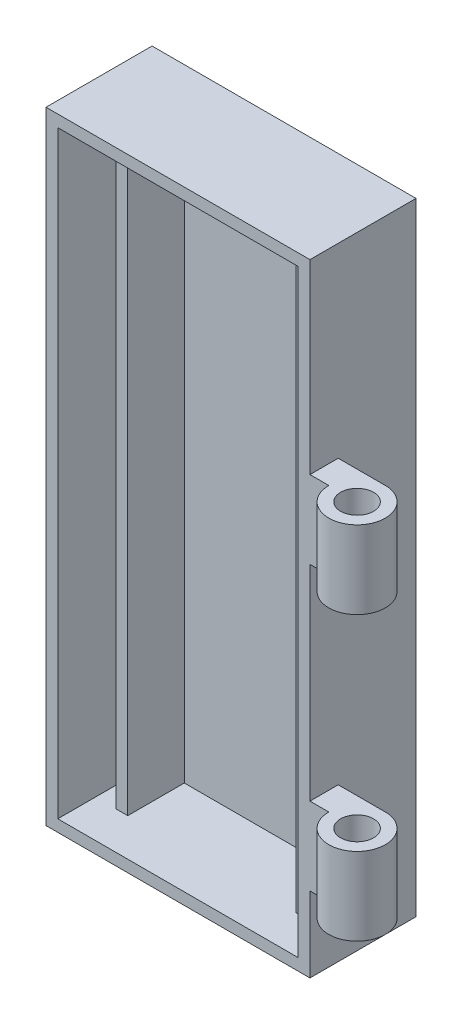
ISO-10303-21;
HEADER;
FILE_DESCRIPTION(('STEP AP214'),'2;1');
FILE_NAME('part.step','',(''),(''),'','','');
FILE_SCHEMA(('AUTOMOTIVE_DESIGN { 1 0 10303 214 1 1 1 1 }'));
ENDSEC;
DATA;
#1=APPLICATION_CONTEXT('core data for automotive mechanical design processes');
#2=APPLICATION_PROTOCOL_DEFINITION('international standard','automotive_design',2000,#1);
#3=PRODUCT_CONTEXT('',#1,'mechanical');
#4=PRODUCT('Part','Part','',(#3));
#5=PRODUCT_RELATED_PRODUCT_CATEGORY('part','',(#4));
#6=PRODUCT_DEFINITION_FORMATION('','',#4);
#7=PRODUCT_DEFINITION_CONTEXT('part definition',#1,'design');
#8=PRODUCT_DEFINITION('design','',#6,#7);
#9=PRODUCT_DEFINITION_SHAPE('','',#8);
#10=(LENGTH_UNIT() NAMED_UNIT(*) SI_UNIT(.MILLI.,.METRE.));
#11=(NAMED_UNIT(*) PLANE_ANGLE_UNIT() SI_UNIT($,.RADIAN.));
#12=(NAMED_UNIT(*) SI_UNIT($,.STERADIAN.) SOLID_ANGLE_UNIT());
#13=UNCERTAINTY_MEASURE_WITH_UNIT(LENGTH_MEASURE(1.E-05),#10,'distance_accuracy_value','');
#14=(GEOMETRIC_REPRESENTATION_CONTEXT(3) GLOBAL_UNCERTAINTY_ASSIGNED_CONTEXT((#13)) GLOBAL_UNIT_ASSIGNED_CONTEXT((#10,
#11,#12)) REPRESENTATION_CONTEXT('',''));
#15=CARTESIAN_POINT('',(0.,0.,0.));
#16=DIRECTION('',(0.,0.,1.));
#17=DIRECTION('',(1.,0.,0.));
#18=AXIS2_PLACEMENT_3D('',#15,#16,#17);
#19=CARTESIAN_POINT('',(0.,0.,11.25));
#20=DIRECTION('',(0.,0.,1.));
#21=DIRECTION('',(1.,0.,0.));
#22=AXIS2_PLACEMENT_3D('',#19,#20,#21);
#23=PLANE('',#22);
#24=DIRECTION('',(1.,0.,0.));
#25=VECTOR('',#24,1.);
#26=CARTESIAN_POINT('',(-12.75,-31.75,11.25));
#27=LINE('',#26,#25);
#28=CARTESIAN_POINT('',(-12.75,-31.75,11.25));
#29=VERTEX_POINT('',#28);
#30=CARTESIAN_POINT('',(12.75,-31.75,11.25));
#31=VERTEX_POINT('',#30);
#32=EDGE_CURVE('E342',#29,#31,#27,.T.);
#33=ORIENTED_EDGE('',*,*,#32,.F.);
#34=DIRECTION('',(0.,-1.,0.));
#35=VECTOR('',#34,1.);
#36=CARTESIAN_POINT('',(-12.75,31.75,11.25));
#37=LINE('',#36,#35);
#38=CARTESIAN_POINT('',(-12.75,31.75,11.25));
#39=VERTEX_POINT('',#38);
#40=EDGE_CURVE('E339',#39,#29,#37,.T.);
#41=ORIENTED_EDGE('',*,*,#40,.F.);
#42=DIRECTION('',(-1.,0.,0.));
#43=VECTOR('',#42,1.);
#44=CARTESIAN_POINT('',(-12.75,31.75,11.25));
#45=LINE('',#44,#43);
#46=CARTESIAN_POINT('',(12.75,31.75,11.25));
#47=VERTEX_POINT('',#46);
#48=EDGE_CURVE('E350',#47,#39,#45,.T.);
#49=ORIENTED_EDGE('',*,*,#48,.F.);
#50=DIRECTION('',(0.,1.,0.));
#51=VECTOR('',#50,1.);
#52=CARTESIAN_POINT('',(12.75,31.75,11.25));
#53=LINE('',#52,#51);
#54=EDGE_CURVE('E346',#31,#47,#53,.T.);
#55=ORIENTED_EDGE('',*,*,#54,.F.);
#56=EDGE_LOOP('',(#33,#41,#49,#55));
#57=FACE_BOUND('',#56,.T.);
#58=DIRECTION('',(0.,1.,0.));
#59=VECTOR('',#58,1.);
#60=CARTESIAN_POINT('',(14.,0.,11.25));
#61=LINE('',#60,#59);
#62=CARTESIAN_POINT('',(14.,-33.,11.25));
#63=VERTEX_POINT('',#62);
#64=CARTESIAN_POINT('',(14.,-25.,11.25));
#65=VERTEX_POINT('',#64);
#66=EDGE_CURVE('E234',#63,#65,#61,.T.);
#67=ORIENTED_EDGE('',*,*,#66,.T.);
#68=DIRECTION('',(1.,0.,0.));
#69=VECTOR('',#68,1.);
#70=CARTESIAN_POINT('',(0.,-25.,11.25));
#71=LINE('',#70,#69);
#72=CARTESIAN_POINT('',(16.,-25.,11.25));
#73=VERTEX_POINT('',#72);
#74=EDGE_CURVE('E248',#65,#73,#71,.T.);
#75=ORIENTED_EDGE('',*,*,#74,.T.);
#76=DIRECTION('',(0.,-1.,0.));
#77=VECTOR('',#76,1.);
#78=CARTESIAN_POINT('',(16.,13.25,11.25));
#79=LINE('',#78,#77);
#80=CARTESIAN_POINT('',(16.,-16.75,11.25));
#81=VERTEX_POINT('',#80);
#82=EDGE_CURVE('E232',#81,#73,#79,.T.);
#83=ORIENTED_EDGE('',*,*,#82,.F.);
#84=DIRECTION('',(-1.,0.,0.));
#85=VECTOR('',#84,1.);
#86=CARTESIAN_POINT('',(0.,-16.75,11.25));
#87=LINE('',#86,#85);
#88=CARTESIAN_POINT('',(14.,-16.75,11.25));
#89=VERTEX_POINT('',#88);
#90=EDGE_CURVE('E222',#81,#89,#87,.T.);
#91=ORIENTED_EDGE('',*,*,#90,.T.);
#92=DIRECTION('',(0.,1.,0.));
#93=VECTOR('',#92,1.);
#94=CARTESIAN_POINT('',(14.,0.,11.25));
#95=LINE('',#94,#93);
#96=CARTESIAN_POINT('',(14.,5.,11.25));
#97=VERTEX_POINT('',#96);
#98=EDGE_CURVE('E209',#89,#97,#95,.T.);
#99=ORIENTED_EDGE('',*,*,#98,.T.);
#100=DIRECTION('',(1.,0.,0.));
#101=VECTOR('',#100,1.);
#102=CARTESIAN_POINT('',(0.,5.,11.25));
#103=LINE('',#102,#101);
#104=CARTESIAN_POINT('',(16.,5.,11.25));
#105=VERTEX_POINT('',#104);
#106=EDGE_CURVE('E241',#97,#105,#103,.T.);
#107=ORIENTED_EDGE('',*,*,#106,.T.);
#108=CARTESIAN_POINT('',(16.,13.25,11.25));
#109=VERTEX_POINT('',#108);
#110=EDGE_CURVE('E268',#109,#105,#79,.T.);
#111=ORIENTED_EDGE('',*,*,#110,.F.);
#112=DIRECTION('',(-1.,0.,0.));
#113=VECTOR('',#112,1.);
#114=CARTESIAN_POINT('',(16.,13.25,11.25));
#115=LINE('',#114,#113);
#116=CARTESIAN_POINT('',(14.,13.25,11.25));
#117=VERTEX_POINT('',#116);
#118=EDGE_CURVE('E263',#109,#117,#115,.T.);
#119=ORIENTED_EDGE('',*,*,#118,.T.);
#120=DIRECTION('',(0.,1.,0.));
#121=VECTOR('',#120,1.);
#122=CARTESIAN_POINT('',(14.,33.,11.25));
#123=LINE('',#122,#121);
#124=CARTESIAN_POINT('',(14.,33.,11.25));
#125=VERTEX_POINT('',#124);
#126=EDGE_CURVE('E390',#117,#125,#123,.T.);
#127=ORIENTED_EDGE('',*,*,#126,.T.);
#128=DIRECTION('',(-1.,0.,0.));
#129=VECTOR('',#128,1.);
#130=CARTESIAN_POINT('',(-14.,33.,11.25));
#131=LINE('',#130,#129);
#132=CARTESIAN_POINT('',(-14.,33.,11.25));
#133=VERTEX_POINT('',#132);
#134=EDGE_CURVE('E393',#125,#133,#131,.T.);
#135=ORIENTED_EDGE('',*,*,#134,.T.);
#136=DIRECTION('',(0.,-1.,0.));
#137=VECTOR('',#136,1.);
#138=CARTESIAN_POINT('',(-14.,33.,11.25));
#139=LINE('',#138,#137);
#140=CARTESIAN_POINT('',(-14.,-33.,11.25));
#141=VERTEX_POINT('',#140);
#142=EDGE_CURVE('E382',#133,#141,#139,.T.);
#143=ORIENTED_EDGE('',*,*,#142,.T.);
#144=DIRECTION('',(1.,0.,0.));
#145=VECTOR('',#144,1.);
#146=CARTESIAN_POINT('',(-14.,-33.,11.25));
#147=LINE('',#146,#145);
#148=EDGE_CURVE('E386',#141,#63,#147,.T.);
#149=ORIENTED_EDGE('',*,*,#148,.T.);
#150=EDGE_LOOP('',(#67,#75,#83,#91,#99,#107,#111,#119,#127,#135,#143,#149));
#151=FACE_BOUND('',#150,.T.);
#152=ADVANCED_FACE('F47',(#57,#151),#23,.T.);
#153=CARTESIAN_POINT('',(-14.,-33.,1.25));
#154=DIRECTION('',(0.,1.,0.));
#155=DIRECTION('',(0.,0.,1.));
#156=AXIS2_PLACEMENT_3D('',#153,#154,#155);
#157=PLANE('',#156);
#158=DIRECTION('',(0.,0.,-1.));
#159=VECTOR('',#158,1.);
#160=CARTESIAN_POINT('',(14.,-33.,1.25));
#161=LINE('',#160,#159);
#162=CARTESIAN_POINT('',(14.,-33.,0.));
#163=VERTEX_POINT('',#162);
#164=EDGE_CURVE('E439',#63,#163,#161,.T.);
#165=ORIENTED_EDGE('',*,*,#164,.F.);
#166=ORIENTED_EDGE('',*,*,#148,.F.);
#167=DIRECTION('',(0.,0.,-1.));
#168=VECTOR('',#167,1.);
#169=CARTESIAN_POINT('',(-14.,-33.,1.25));
#170=LINE('',#169,#168);
#171=CARTESIAN_POINT('',(-14.,-33.,0.));
#172=VERTEX_POINT('',#171);
#173=EDGE_CURVE('E442',#141,#172,#170,.T.);
#174=ORIENTED_EDGE('',*,*,#173,.T.);
#175=DIRECTION('',(1.,0.,0.));
#176=VECTOR('',#175,1.);
#177=CARTESIAN_POINT('',(-14.,-33.,0.));
#178=LINE('',#177,#176);
#179=EDGE_CURVE('E421',#172,#163,#178,.T.);
#180=ORIENTED_EDGE('',*,*,#179,.T.);
#181=EDGE_LOOP('',(#165,#166,#174,#180));
#182=FACE_BOUND('',#181,.T.);
#183=ADVANCED_FACE('F467',(#182),#157,.F.);
#184=CARTESIAN_POINT('',(19.,13.25,11.25));
#185=DIRECTION('',(0.,-1.,0.));
#186=DIRECTION('',(0.,0.,-1.));
#187=AXIS2_PLACEMENT_3D('',#184,#185,#186);
#188=CYLINDRICAL_SURFACE('',#187,3.);
#189=ORIENTED_EDGE('',*,*,#82,.T.);
#190=CARTESIAN_POINT('',(19.,-25.,11.25));
#191=DIRECTION('',(0.,-1.,0.));
#192=DIRECTION('',(0.,0.,-1.));
#193=AXIS2_PLACEMENT_3D('',#190,#191,#192);
#194=CIRCLE('',#193,3.);
#195=CARTESIAN_POINT('',(19.,-25.,8.25));
#196=VERTEX_POINT('',#195);
#197=EDGE_CURVE('E239',#73,#196,#194,.F.);
#198=ORIENTED_EDGE('',*,*,#197,.T.);
#199=DIRECTION('',(0.,-1.,0.));
#200=VECTOR('',#199,1.);
#201=CARTESIAN_POINT('',(19.,13.25,8.25));
#202=LINE('',#201,#200);
#203=CARTESIAN_POINT('',(19.,-16.75,8.25));
#204=VERTEX_POINT('',#203);
#205=EDGE_CURVE('E277',#204,#196,#202,.T.);
#206=ORIENTED_EDGE('',*,*,#205,.F.);
#207=CARTESIAN_POINT('',(19.,-16.75,11.25));
#208=DIRECTION('',(0.,1.,0.));
#209=DIRECTION('',(-1.,0.,0.));
#210=AXIS2_PLACEMENT_3D('',#207,#208,#209);
#211=CIRCLE('',#210,3.);
#212=EDGE_CURVE('E235',#204,#81,#211,.F.);
#213=ORIENTED_EDGE('',*,*,#212,.T.);
#214=EDGE_LOOP('',(#189,#198,#206,#213));
#215=FACE_BOUND('',#214,.T.);
#216=ADVANCED_FACE('F455',(#215),#188,.T.);
#217=ORIENTED_EDGE('',*,*,#110,.T.);
#218=CARTESIAN_POINT('',(19.,5.,11.25));
#219=DIRECTION('',(0.,-1.,0.));
#220=DIRECTION('',(0.,0.,-1.));
#221=AXIS2_PLACEMENT_3D('',#218,#219,#220);
#222=CIRCLE('',#221,3.);
#223=CARTESIAN_POINT('',(19.,5.,8.25));
#224=VERTEX_POINT('',#223);
#225=EDGE_CURVE('E217',#105,#224,#222,.F.);
#226=ORIENTED_EDGE('',*,*,#225,.T.);
#227=CARTESIAN_POINT('',(19.,13.25,8.25));
#228=VERTEX_POINT('',#227);
#229=EDGE_CURVE('E273',#228,#224,#202,.T.);
#230=ORIENTED_EDGE('',*,*,#229,.F.);
#231=CARTESIAN_POINT('',(19.,13.25,11.25));
#232=DIRECTION('',(0.,-1.,0.));
#233=DIRECTION('',(0.,0.,-1.));
#234=AXIS2_PLACEMENT_3D('',#231,#232,#233);
#235=CIRCLE('',#234,3.);
#236=EDGE_CURVE('E259',#228,#109,#235,.T.);
#237=ORIENTED_EDGE('',*,*,#236,.T.);
#238=EDGE_LOOP('',(#217,#226,#230,#237));
#239=FACE_BOUND('',#238,.T.);
#240=ADVANCED_FACE('F490',(#239),#188,.T.);
#241=CARTESIAN_POINT('',(14.,13.25,8.25));
#242=DIRECTION('',(0.,0.,-1.));
#243=DIRECTION('',(-1.,0.,0.));
#244=AXIS2_PLACEMENT_3D('',#241,#242,#243);
#245=PLANE('',#244);
#246=ORIENTED_EDGE('',*,*,#205,.T.);
#247=DIRECTION('',(-1.,0.,0.));
#248=VECTOR('',#247,1.);
#249=CARTESIAN_POINT('',(14.,-25.,8.25));
#250=LINE('',#249,#248);
#251=CARTESIAN_POINT('',(14.,-25.,8.25));
#252=VERTEX_POINT('',#251);
#253=EDGE_CURVE('E11',#196,#252,#250,.T.);
#254=ORIENTED_EDGE('',*,*,#253,.T.);
#255=DIRECTION('',(0.,-1.,0.));
#256=VECTOR('',#255,1.);
#257=CARTESIAN_POINT('',(14.,13.25,8.25));
#258=LINE('',#257,#256);
#259=CARTESIAN_POINT('',(14.,-16.75,8.25));
#260=VERTEX_POINT('',#259);
#261=EDGE_CURVE('E267',#260,#252,#258,.T.);
#262=ORIENTED_EDGE('',*,*,#261,.F.);
#263=DIRECTION('',(1.,0.,0.));
#264=VECTOR('',#263,1.);
#265=CARTESIAN_POINT('',(14.,-16.75,8.25));
#266=LINE('',#265,#264);
#267=EDGE_CURVE('E56',#260,#204,#266,.T.);
#268=ORIENTED_EDGE('',*,*,#267,.T.);
#269=EDGE_LOOP('',(#246,#254,#262,#268));
#270=FACE_BOUND('',#269,.T.);
#271=ADVANCED_FACE('F453',(#270),#245,.T.);
#272=ORIENTED_EDGE('',*,*,#229,.T.);
#273=DIRECTION('',(-1.,0.,0.));
#274=VECTOR('',#273,1.);
#275=CARTESIAN_POINT('',(14.,5.,8.25));
#276=LINE('',#275,#274);
#277=CARTESIAN_POINT('',(14.,5.,8.25));
#278=VERTEX_POINT('',#277);
#279=EDGE_CURVE('E446',#224,#278,#276,.T.);
#280=ORIENTED_EDGE('',*,*,#279,.T.);
#281=CARTESIAN_POINT('',(14.,13.25,8.25));
#282=VERTEX_POINT('',#281);
#283=EDGE_CURVE('E278',#282,#278,#258,.T.);
#284=ORIENTED_EDGE('',*,*,#283,.F.);
#285=DIRECTION('',(1.,0.,0.));
#286=VECTOR('',#285,1.);
#287=CARTESIAN_POINT('',(14.,13.25,8.25));
#288=LINE('',#287,#286);
#289=EDGE_CURVE('E255',#282,#228,#288,.T.);
#290=ORIENTED_EDGE('',*,*,#289,.T.);
#291=EDGE_LOOP('',(#272,#280,#284,#290));
#292=FACE_BOUND('',#291,.T.);
#293=ADVANCED_FACE('F485',(#292),#245,.T.);
#294=CARTESIAN_POINT('',(0.,0.,1.25));
#295=DIRECTION('',(0.,0.,1.));
#296=DIRECTION('',(1.,0.,0.));
#297=AXIS2_PLACEMENT_3D('',#294,#295,#296);
#298=PLANE('',#297);
#299=DIRECTION('',(1.,0.,0.));
#300=VECTOR('',#299,1.);
#301=CARTESIAN_POINT('',(-12.75,-31.75,1.25));
#302=LINE('',#301,#300);
#303=CARTESIAN_POINT('',(-9.32837106541102,-31.75,1.25));
#304=VERTEX_POINT('',#303);
#305=CARTESIAN_POINT('',(8.52162893458898,-31.75,1.25));
#306=VERTEX_POINT('',#305);
#307=EDGE_CURVE('E362',#304,#306,#302,.T.);
#308=ORIENTED_EDGE('',*,*,#307,.T.);
#309=DIRECTION('',(0.,-1.,0.));
#310=VECTOR('',#309,1.);
#311=CARTESIAN_POINT('',(8.52162893458897,30.5,1.25));
#312=LINE('',#311,#310);
#313=CARTESIAN_POINT('',(8.52162893458897,29.5,1.25));
#314=VERTEX_POINT('',#313);
#315=EDGE_CURVE('E295',#314,#306,#312,.T.);
#316=ORIENTED_EDGE('',*,*,#315,.F.);
#317=DIRECTION('',(1.,0.,0.));
#318=VECTOR('',#317,1.);
#319=CARTESIAN_POINT('',(8.52162893458897,29.5,1.25));
#320=LINE('',#319,#318);
#321=CARTESIAN_POINT('',(-9.32837106541102,29.5,1.25));
#322=VERTEX_POINT('',#321);
#323=EDGE_CURVE('E397',#322,#314,#320,.T.);
#324=ORIENTED_EDGE('',*,*,#323,.F.);
#325=DIRECTION('',(0.,1.,0.));
#326=VECTOR('',#325,1.);
#327=CARTESIAN_POINT('',(-9.32837106541102,30.5,1.25));
#328=LINE('',#327,#326);
#329=EDGE_CURVE('E299',#304,#322,#328,.T.);
#330=ORIENTED_EDGE('',*,*,#329,.F.);
#331=EDGE_LOOP('',(#308,#316,#324,#330));
#332=FACE_BOUND('',#331,.T.);
#333=ADVANCED_FACE('F554',(#332),#298,.T.);
#334=DIRECTION('',(-1.,0.,0.));
#335=VECTOR('',#334,1.);
#336=CARTESIAN_POINT('',(8.52162893458897,30.5,1.25));
#337=LINE('',#336,#335);
#338=CARTESIAN_POINT('',(9.77162893458897,30.5,1.25));
#339=VERTEX_POINT('',#338);
#340=CARTESIAN_POINT('',(-10.578371065411,30.5,1.25));
#341=VERTEX_POINT('',#340);
#342=EDGE_CURVE('E71',#339,#341,#337,.T.);
#343=ORIENTED_EDGE('',*,*,#342,.F.);
#344=DIRECTION('',(0.,1.,0.));
#345=VECTOR('',#344,1.);
#346=CARTESIAN_POINT('',(9.77162893458897,30.5,1.25));
#347=LINE('',#346,#345);
#348=CARTESIAN_POINT('',(9.77162893458897,-31.75,1.25));
#349=VERTEX_POINT('',#348);
#350=EDGE_CURVE('E286',#349,#339,#347,.T.);
#351=ORIENTED_EDGE('',*,*,#350,.F.);
#352=CARTESIAN_POINT('',(12.75,-31.75,1.25));
#353=VERTEX_POINT('',#352);
#354=EDGE_CURVE('E356',#349,#353,#302,.T.);
#355=ORIENTED_EDGE('',*,*,#354,.T.);
#356=DIRECTION('',(0.,1.,0.));
#357=VECTOR('',#356,1.);
#358=CARTESIAN_POINT('',(12.75,31.75,1.25));
#359=LINE('',#358,#357);
#360=CARTESIAN_POINT('',(12.75,31.75,1.25));
#361=VERTEX_POINT('',#360);
#362=EDGE_CURVE('E361',#353,#361,#359,.T.);
#363=ORIENTED_EDGE('',*,*,#362,.T.);
#364=DIRECTION('',(-1.,0.,0.));
#365=VECTOR('',#364,1.);
#366=CARTESIAN_POINT('',(-12.75,31.75,1.25));
#367=LINE('',#366,#365);
#368=CARTESIAN_POINT('',(-12.75,31.75,1.25));
#369=VERTEX_POINT('',#368);
#370=EDGE_CURVE('E343',#361,#369,#367,.T.);
#371=ORIENTED_EDGE('',*,*,#370,.T.);
#372=DIRECTION('',(0.,-1.,0.));
#373=VECTOR('',#372,1.);
#374=CARTESIAN_POINT('',(-12.75,31.75,1.25));
#375=LINE('',#374,#373);
#376=CARTESIAN_POINT('',(-12.75,-31.75,1.25));
#377=VERTEX_POINT('',#376);
#378=EDGE_CURVE('E312',#369,#377,#375,.T.);
#379=ORIENTED_EDGE('',*,*,#378,.T.);
#380=CARTESIAN_POINT('',(-10.578371065411,-31.75,1.25));
#381=VERTEX_POINT('',#380);
#382=EDGE_CURVE('E357',#377,#381,#302,.T.);
#383=ORIENTED_EDGE('',*,*,#382,.T.);
#384=DIRECTION('',(0.,-1.,0.));
#385=VECTOR('',#384,1.);
#386=CARTESIAN_POINT('',(-10.578371065411,30.5,1.25));
#387=LINE('',#386,#385);
#388=EDGE_CURVE('E324',#341,#381,#387,.T.);
#389=ORIENTED_EDGE('',*,*,#388,.F.);
#390=EDGE_LOOP('',(#343,#351,#355,#363,#371,#379,#383,#389));
#391=FACE_BOUND('',#390,.T.);
#392=ADVANCED_FACE('F557',(#391),#298,.T.);
#393=CARTESIAN_POINT('',(-12.75,-31.75,11.25));
#394=DIRECTION('',(0.,1.,0.));
#395=DIRECTION('',(0.,0.,1.));
#396=AXIS2_PLACEMENT_3D('',#393,#394,#395);
#397=PLANE('',#396);
#398=DIRECTION('',(1.,0.,0.));
#399=VECTOR('',#398,1.);
#400=CARTESIAN_POINT('',(8.52162893458897,-31.75,7.25));
#401=LINE('',#400,#399);
#402=CARTESIAN_POINT('',(8.52162893458898,-31.75,7.25));
#403=VERTEX_POINT('',#402);
#404=CARTESIAN_POINT('',(9.77162893458897,-31.75,7.25));
#405=VERTEX_POINT('',#404);
#406=EDGE_CURVE('E285',#403,#405,#401,.T.);
#407=ORIENTED_EDGE('',*,*,#406,.F.);
#408=DIRECTION('',(0.,0.,-1.));
#409=VECTOR('',#408,1.);
#410=CARTESIAN_POINT('',(8.52162893458897,-31.75,7.25));
#411=LINE('',#410,#409);
#412=EDGE_CURVE('E309',#403,#306,#411,.T.);
#413=ORIENTED_EDGE('',*,*,#412,.T.);
#414=ORIENTED_EDGE('',*,*,#307,.F.);
#415=DIRECTION('',(0.,0.,-1.));
#416=VECTOR('',#415,1.);
#417=CARTESIAN_POINT('',(-9.32837106541102,-31.75,7.25));
#418=LINE('',#417,#416);
#419=CARTESIAN_POINT('',(-9.32837106541102,-31.75,7.25));
#420=VERTEX_POINT('',#419);
#421=EDGE_CURVE('E320',#420,#304,#418,.T.);
#422=ORIENTED_EDGE('',*,*,#421,.F.);
#423=DIRECTION('',(1.,0.,0.));
#424=VECTOR('',#423,1.);
#425=CARTESIAN_POINT('',(-9.32837106541102,-31.75,7.25));
#426=LINE('',#425,#424);
#427=CARTESIAN_POINT('',(-10.578371065411,-31.75,7.25));
#428=VERTEX_POINT('',#427);
#429=EDGE_CURVE('E323',#428,#420,#426,.T.);
#430=ORIENTED_EDGE('',*,*,#429,.F.);
#431=DIRECTION('',(0.,0.,-1.));
#432=VECTOR('',#431,1.);
#433=CARTESIAN_POINT('',(-10.578371065411,-31.75,7.25));
#434=LINE('',#433,#432);
#435=EDGE_CURVE('E316',#428,#381,#434,.T.);
#436=ORIENTED_EDGE('',*,*,#435,.T.);
#437=ORIENTED_EDGE('',*,*,#382,.F.);
#438=DIRECTION('',(0.,0.,-1.));
#439=VECTOR('',#438,1.);
#440=CARTESIAN_POINT('',(-12.75,-31.75,11.25));
#441=LINE('',#440,#439);
#442=EDGE_CURVE('E378',#29,#377,#441,.T.);
#443=ORIENTED_EDGE('',*,*,#442,.F.);
#444=ORIENTED_EDGE('',*,*,#32,.T.);
#445=DIRECTION('',(0.,0.,-1.));
#446=VECTOR('',#445,1.);
#447=CARTESIAN_POINT('',(12.75,-31.75,11.25));
#448=LINE('',#447,#446);
#449=EDGE_CURVE('E374',#31,#353,#448,.T.);
#450=ORIENTED_EDGE('',*,*,#449,.T.);
#451=ORIENTED_EDGE('',*,*,#354,.F.);
#452=DIRECTION('',(0.,0.,-1.));
#453=VECTOR('',#452,1.);
#454=CARTESIAN_POINT('',(9.77162893458897,-31.75,7.25));
#455=LINE('',#454,#453);
#456=EDGE_CURVE('E305',#405,#349,#455,.T.);
#457=ORIENTED_EDGE('',*,*,#456,.F.);
#458=EDGE_LOOP('',(#407,#413,#414,#422,#430,#436,#437,#443,#444,#450,#451,#457));
#459=FACE_BOUND('',#458,.T.);
#460=ADVANCED_FACE('F552',(#459),#397,.T.);
#461=CARTESIAN_POINT('',(8.52162893458897,29.5,7.25));
#462=DIRECTION('',(0.,1.,0.));
#463=DIRECTION('',(-1.,0.,0.));
#464=AXIS2_PLACEMENT_3D('',#461,#462,#463);
#465=PLANE('',#464);
#466=ORIENTED_EDGE('',*,*,#323,.T.);
#467=DIRECTION('',(0.,0.,-1.));
#468=VECTOR('',#467,1.);
#469=CARTESIAN_POINT('',(8.52162893458897,29.5,7.25));
#470=LINE('',#469,#468);
#471=CARTESIAN_POINT('',(8.52162893458897,29.5,7.25));
#472=VERTEX_POINT('',#471);
#473=EDGE_CURVE('E404',#472,#314,#470,.T.);
#474=ORIENTED_EDGE('',*,*,#473,.F.);
#475=DIRECTION('',(1.,0.,0.));
#476=VECTOR('',#475,1.);
#477=CARTESIAN_POINT('',(8.52162893458897,29.5,7.25));
#478=LINE('',#477,#476);
#479=CARTESIAN_POINT('',(-9.32837106541102,29.5,7.25));
#480=VERTEX_POINT('',#479);
#481=EDGE_CURVE('E398',#480,#472,#478,.T.);
#482=ORIENTED_EDGE('',*,*,#481,.F.);
#483=DIRECTION('',(0.,0.,-1.));
#484=VECTOR('',#483,1.);
#485=CARTESIAN_POINT('',(-9.32837106541102,29.5,7.25));
#486=LINE('',#485,#484);
#487=EDGE_CURVE('E413',#480,#322,#486,.T.);
#488=ORIENTED_EDGE('',*,*,#487,.T.);
#489=EDGE_LOOP('',(#466,#474,#482,#488));
#490=FACE_BOUND('',#489,.T.);
#491=ADVANCED_FACE('F548',(#490),#465,.F.);
#492=CARTESIAN_POINT('',(8.52162893458897,30.5,7.25));
#493=DIRECTION('',(0.,-1.,0.));
#494=DIRECTION('',(0.,0.,-1.));
#495=AXIS2_PLACEMENT_3D('',#492,#493,#494);
#496=PLANE('',#495);
#497=ORIENTED_EDGE('',*,*,#342,.T.);
#498=DIRECTION('',(0.,0.,-1.));
#499=VECTOR('',#498,1.);
#500=CARTESIAN_POINT('',(-10.578371065411,30.5,7.25));
#501=LINE('',#500,#499);
#502=CARTESIAN_POINT('',(-10.578371065411,30.5,7.25));
#503=VERTEX_POINT('',#502);
#504=EDGE_CURVE('E272',#503,#341,#501,.T.);
#505=ORIENTED_EDGE('',*,*,#504,.F.);
#506=DIRECTION('',(-1.,0.,0.));
#507=VECTOR('',#506,1.);
#508=CARTESIAN_POINT('',(8.52162893458897,30.5,7.25));
#509=LINE('',#508,#507);
#510=CARTESIAN_POINT('',(9.77162893458897,30.5,7.25));
#511=VERTEX_POINT('',#510);
#512=EDGE_CURVE('E401',#511,#503,#509,.T.);
#513=ORIENTED_EDGE('',*,*,#512,.F.);
#514=DIRECTION('',(0.,0.,-1.));
#515=VECTOR('',#514,1.);
#516=CARTESIAN_POINT('',(9.77162893458897,30.5,7.25));
#517=LINE('',#516,#515);
#518=EDGE_CURVE('E294',#511,#339,#517,.T.);
#519=ORIENTED_EDGE('',*,*,#518,.T.);
#520=EDGE_LOOP('',(#497,#505,#513,#519));
#521=FACE_BOUND('',#520,.T.);
#522=ADVANCED_FACE('F544',(#521),#496,.F.);
#523=CARTESIAN_POINT('',(0.,0.,7.25));
#524=DIRECTION('',(0.,0.,1.));
#525=DIRECTION('',(1.,0.,0.));
#526=AXIS2_PLACEMENT_3D('',#523,#524,#525);
#527=PLANE('',#526);
#528=ORIENTED_EDGE('',*,*,#512,.T.);
#529=DIRECTION('',(0.,-1.,0.));
#530=VECTOR('',#529,1.);
#531=CARTESIAN_POINT('',(-10.578371065411,30.5,7.25));
#532=LINE('',#531,#530);
#533=EDGE_CURVE('E332',#503,#428,#532,.T.);
#534=ORIENTED_EDGE('',*,*,#533,.T.);
#535=ORIENTED_EDGE('',*,*,#429,.T.);
#536=DIRECTION('',(0.,1.,0.));
#537=VECTOR('',#536,1.);
#538=CARTESIAN_POINT('',(-9.32837106541102,30.5,7.25));
#539=LINE('',#538,#537);
#540=EDGE_CURVE('E327',#420,#480,#539,.T.);
#541=ORIENTED_EDGE('',*,*,#540,.T.);
#542=ORIENTED_EDGE('',*,*,#481,.T.);
#543=DIRECTION('',(0.,-1.,0.));
#544=VECTOR('',#543,1.);
#545=CARTESIAN_POINT('',(8.52162893458897,30.5,7.25));
#546=LINE('',#545,#544);
#547=EDGE_CURVE('E281',#472,#403,#546,.T.);
#548=ORIENTED_EDGE('',*,*,#547,.T.);
#549=ORIENTED_EDGE('',*,*,#406,.T.);
#550=DIRECTION('',(0.,1.,0.));
#551=VECTOR('',#550,1.);
#552=CARTESIAN_POINT('',(9.77162893458897,30.5,7.25));
#553=LINE('',#552,#551);
#554=EDGE_CURVE('E290',#405,#511,#553,.T.);
#555=ORIENTED_EDGE('',*,*,#554,.T.);
#556=EDGE_LOOP('',(#528,#534,#535,#541,#542,#548,#549,#555));
#557=FACE_BOUND('',#556,.T.);
#558=ADVANCED_FACE('F541',(#557),#527,.T.);
#559=CARTESIAN_POINT('',(-12.75,31.75,11.25));
#560=DIRECTION('',(1.,0.,0.));
#561=DIRECTION('',(0.,1.,0.));
#562=AXIS2_PLACEMENT_3D('',#559,#560,#561);
#563=PLANE('',#562);
#564=ORIENTED_EDGE('',*,*,#378,.F.);
#565=DIRECTION('',(0.,0.,-1.));
#566=VECTOR('',#565,1.);
#567=CARTESIAN_POINT('',(-12.75,31.75,11.25));
#568=LINE('',#567,#566);
#569=EDGE_CURVE('E353',#39,#369,#568,.T.);
#570=ORIENTED_EDGE('',*,*,#569,.F.);
#571=ORIENTED_EDGE('',*,*,#40,.T.);
#572=ORIENTED_EDGE('',*,*,#442,.T.);
#573=EDGE_LOOP('',(#564,#570,#571,#572));
#574=FACE_BOUND('',#573,.T.);
#575=ADVANCED_FACE('F539',(#574),#563,.T.);
#576=CARTESIAN_POINT('',(12.75,31.75,11.25));
#577=DIRECTION('',(-1.,0.,0.));
#578=DIRECTION('',(0.,-1.,0.));
#579=AXIS2_PLACEMENT_3D('',#576,#577,#578);
#580=PLANE('',#579);
#581=ORIENTED_EDGE('',*,*,#362,.F.);
#582=ORIENTED_EDGE('',*,*,#449,.F.);
#583=ORIENTED_EDGE('',*,*,#54,.T.);
#584=DIRECTION('',(0.,0.,-1.));
#585=VECTOR('',#584,1.);
#586=CARTESIAN_POINT('',(12.75,31.75,11.25));
#587=LINE('',#586,#585);
#588=EDGE_CURVE('E370',#47,#361,#587,.T.);
#589=ORIENTED_EDGE('',*,*,#588,.T.);
#590=EDGE_LOOP('',(#581,#582,#583,#589));
#591=FACE_BOUND('',#590,.T.);
#592=ADVANCED_FACE('F587',(#591),#580,.T.);
#593=CARTESIAN_POINT('',(-12.75,31.75,11.25));
#594=DIRECTION('',(0.,-1.,0.));
#595=DIRECTION('',(0.,0.,-1.));
#596=AXIS2_PLACEMENT_3D('',#593,#594,#595);
#597=PLANE('',#596);
#598=ORIENTED_EDGE('',*,*,#370,.F.);
#599=ORIENTED_EDGE('',*,*,#588,.F.);
#600=ORIENTED_EDGE('',*,*,#48,.T.);
#601=ORIENTED_EDGE('',*,*,#569,.T.);
#602=EDGE_LOOP('',(#598,#599,#600,#601));
#603=FACE_BOUND('',#602,.T.);
#604=ADVANCED_FACE('F561',(#603),#597,.T.);
#605=CARTESIAN_POINT('',(0.,0.,0.));
#606=DIRECTION('',(0.,0.,1.));
#607=DIRECTION('',(1.,0.,0.));
#608=AXIS2_PLACEMENT_3D('',#605,#606,#607);
#609=PLANE('',#608);
#610=DIRECTION('',(0.,-1.,0.));
#611=VECTOR('',#610,1.);
#612=CARTESIAN_POINT('',(-14.,33.,0.));
#613=LINE('',#612,#611);
#614=CARTESIAN_POINT('',(-14.,33.,0.));
#615=VERTEX_POINT('',#614);
#616=EDGE_CURVE('E417',#615,#172,#613,.T.);
#617=ORIENTED_EDGE('',*,*,#616,.F.);
#618=DIRECTION('',(-1.,0.,0.));
#619=VECTOR('',#618,1.);
#620=CARTESIAN_POINT('',(-14.,33.,0.));
#621=LINE('',#620,#619);
#622=CARTESIAN_POINT('',(14.,33.,0.));
#623=VERTEX_POINT('',#622);
#624=EDGE_CURVE('E428',#623,#615,#621,.T.);
#625=ORIENTED_EDGE('',*,*,#624,.F.);
#626=DIRECTION('',(0.,1.,0.));
#627=VECTOR('',#626,1.);
#628=CARTESIAN_POINT('',(14.,33.,0.));
#629=LINE('',#628,#627);
#630=EDGE_CURVE('E425',#163,#623,#629,.T.);
#631=ORIENTED_EDGE('',*,*,#630,.F.);
#632=ORIENTED_EDGE('',*,*,#179,.F.);
#633=EDGE_LOOP('',(#617,#625,#631,#632));
#634=FACE_BOUND('',#633,.T.);
#635=ADVANCED_FACE('F477',(#634),#609,.F.);
#636=CARTESIAN_POINT('',(-14.,33.,1.25));
#637=DIRECTION('',(0.,-1.,0.));
#638=DIRECTION('',(0.,0.,-1.));
#639=AXIS2_PLACEMENT_3D('',#636,#637,#638);
#640=PLANE('',#639);
#641=ORIENTED_EDGE('',*,*,#624,.T.);
#642=DIRECTION('',(0.,0.,-1.));
#643=VECTOR('',#642,1.);
#644=CARTESIAN_POINT('',(-14.,33.,1.25));
#645=LINE('',#644,#643);
#646=EDGE_CURVE('E431',#133,#615,#645,.T.);
#647=ORIENTED_EDGE('',*,*,#646,.F.);
#648=ORIENTED_EDGE('',*,*,#134,.F.);
#649=DIRECTION('',(0.,0.,-1.));
#650=VECTOR('',#649,1.);
#651=CARTESIAN_POINT('',(14.,33.,1.25));
#652=LINE('',#651,#650);
#653=EDGE_CURVE('E435',#125,#623,#652,.T.);
#654=ORIENTED_EDGE('',*,*,#653,.T.);
#655=EDGE_LOOP('',(#641,#647,#648,#654));
#656=FACE_BOUND('',#655,.T.);
#657=ADVANCED_FACE('F475',(#656),#640,.F.);
#658=CARTESIAN_POINT('',(14.,33.,1.25));
#659=DIRECTION('',(-1.,0.,0.));
#660=DIRECTION('',(0.,-1.,0.));
#661=AXIS2_PLACEMENT_3D('',#658,#659,#660);
#662=PLANE('',#661);
#663=ORIENTED_EDGE('',*,*,#630,.T.);
#664=ORIENTED_EDGE('',*,*,#653,.F.);
#665=ORIENTED_EDGE('',*,*,#126,.F.);
#666=DIRECTION('',(0.,0.,-1.));
#667=VECTOR('',#666,1.);
#668=CARTESIAN_POINT('',(14.,13.25,11.25));
#669=LINE('',#668,#667);
#670=EDGE_CURVE('E251',#117,#282,#669,.T.);
#671=ORIENTED_EDGE('',*,*,#670,.T.);
#672=ORIENTED_EDGE('',*,*,#283,.T.);
#673=DIRECTION('',(0.,0.,1.));
#674=VECTOR('',#673,1.);
#675=CARTESIAN_POINT('',(14.,5.,0.));
#676=LINE('',#675,#674);
#677=EDGE_CURVE('E212',#278,#97,#676,.T.);
#678=ORIENTED_EDGE('',*,*,#677,.T.);
#679=ORIENTED_EDGE('',*,*,#98,.F.);
#680=DIRECTION('',(0.,0.,-1.));
#681=VECTOR('',#680,1.);
#682=CARTESIAN_POINT('',(14.,-16.75,0.));
#683=LINE('',#682,#681);
#684=EDGE_CURVE('E63',#89,#260,#683,.T.);
#685=ORIENTED_EDGE('',*,*,#684,.T.);
#686=ORIENTED_EDGE('',*,*,#261,.T.);
#687=DIRECTION('',(0.,0.,1.));
#688=VECTOR('',#687,1.);
#689=CARTESIAN_POINT('',(14.,-25.,0.));
#690=LINE('',#689,#688);
#691=EDGE_CURVE('E218',#252,#65,#690,.T.);
#692=ORIENTED_EDGE('',*,*,#691,.T.);
#693=ORIENTED_EDGE('',*,*,#66,.F.);
#694=ORIENTED_EDGE('',*,*,#164,.T.);
#695=EDGE_LOOP('',(#663,#664,#665,#671,#672,#678,#679,#685,#686,#692,#693,#694));
#696=FACE_BOUND('',#695,.T.);
#697=ADVANCED_FACE('F210',(#696),#662,.F.);
#698=CARTESIAN_POINT('',(-14.,33.,1.25));
#699=DIRECTION('',(1.,0.,0.));
#700=DIRECTION('',(0.,1.,0.));
#701=AXIS2_PLACEMENT_3D('',#698,#699,#700);
#702=PLANE('',#701);
#703=ORIENTED_EDGE('',*,*,#616,.T.);
#704=ORIENTED_EDGE('',*,*,#173,.F.);
#705=ORIENTED_EDGE('',*,*,#142,.F.);
#706=ORIENTED_EDGE('',*,*,#646,.T.);
#707=EDGE_LOOP('',(#703,#704,#705,#706));
#708=FACE_BOUND('',#707,.T.);
#709=ADVANCED_FACE('F49',(#708),#702,.F.);
#710=CARTESIAN_POINT('',(-9.32837106541102,30.5,7.25));
#711=DIRECTION('',(-1.,0.,0.));
#712=DIRECTION('',(0.,0.,1.));
#713=AXIS2_PLACEMENT_3D('',#710,#711,#712);
#714=PLANE('',#713);
#715=ORIENTED_EDGE('',*,*,#329,.T.);
#716=ORIENTED_EDGE('',*,*,#487,.F.);
#717=ORIENTED_EDGE('',*,*,#540,.F.);
#718=ORIENTED_EDGE('',*,*,#421,.T.);
#719=EDGE_LOOP('',(#715,#716,#717,#718));
#720=FACE_BOUND('',#719,.T.);
#721=ADVANCED_FACE('F569',(#720),#714,.F.);
#722=CARTESIAN_POINT('',(-10.578371065411,30.5,7.25));
#723=DIRECTION('',(1.,0.,0.));
#724=DIRECTION('',(0.,0.,-1.));
#725=AXIS2_PLACEMENT_3D('',#722,#723,#724);
#726=PLANE('',#725);
#727=ORIENTED_EDGE('',*,*,#388,.T.);
#728=ORIENTED_EDGE('',*,*,#435,.F.);
#729=ORIENTED_EDGE('',*,*,#533,.F.);
#730=ORIENTED_EDGE('',*,*,#504,.T.);
#731=EDGE_LOOP('',(#727,#728,#729,#730));
#732=FACE_BOUND('',#731,.T.);
#733=ADVANCED_FACE('F573',(#732),#726,.F.);
#734=CARTESIAN_POINT('',(8.52162893458897,30.5,7.25));
#735=DIRECTION('',(1.,0.,0.));
#736=DIRECTION('',(0.,0.,-1.));
#737=AXIS2_PLACEMENT_3D('',#734,#735,#736);
#738=PLANE('',#737);
#739=ORIENTED_EDGE('',*,*,#547,.F.);
#740=ORIENTED_EDGE('',*,*,#473,.T.);
#741=ORIENTED_EDGE('',*,*,#315,.T.);
#742=ORIENTED_EDGE('',*,*,#412,.F.);
#743=EDGE_LOOP('',(#739,#740,#741,#742));
#744=FACE_BOUND('',#743,.T.);
#745=ADVANCED_FACE('F579',(#744),#738,.F.);
#746=CARTESIAN_POINT('',(9.77162893458897,30.5,7.25));
#747=DIRECTION('',(-1.,0.,0.));
#748=DIRECTION('',(0.,0.,1.));
#749=AXIS2_PLACEMENT_3D('',#746,#747,#748);
#750=PLANE('',#749);
#751=ORIENTED_EDGE('',*,*,#350,.T.);
#752=ORIENTED_EDGE('',*,*,#518,.F.);
#753=ORIENTED_EDGE('',*,*,#554,.F.);
#754=ORIENTED_EDGE('',*,*,#456,.T.);
#755=EDGE_LOOP('',(#751,#752,#753,#754));
#756=FACE_BOUND('',#755,.T.);
#757=ADVANCED_FACE('F627',(#756),#750,.F.);
#758=CARTESIAN_POINT('',(19.,13.25,11.25));
#759=DIRECTION('',(0.,-1.,0.));
#760=DIRECTION('',(0.,0.,-1.));
#761=AXIS2_PLACEMENT_3D('',#758,#759,#760);
#762=PLANE('',#761);
#763=CARTESIAN_POINT('',(19.,13.25,11.25));
#764=DIRECTION('',(0.,-1.,0.));
#765=DIRECTION('',(0.,0.,-1.));
#766=AXIS2_PLACEMENT_3D('',#763,#764,#765);
#767=CIRCLE('',#766,1.75);
#768=CARTESIAN_POINT('',(19.,13.25,9.49999999999999));
#769=VERTEX_POINT('',#768);
#770=EDGE_CURVE('E496',#769,#769,#767,.T.);
#771=ORIENTED_EDGE('',*,*,#770,.T.);
#772=EDGE_LOOP('',(#771));
#773=FACE_BOUND('',#772,.T.);
#774=ORIENTED_EDGE('',*,*,#670,.F.);
#775=ORIENTED_EDGE('',*,*,#118,.F.);
#776=ORIENTED_EDGE('',*,*,#236,.F.);
#777=ORIENTED_EDGE('',*,*,#289,.F.);
#778=EDGE_LOOP('',(#774,#775,#776,#777));
#779=FACE_BOUND('',#778,.T.);
#780=ADVANCED_FACE('F482',(#773,#779),#762,.F.);
#781=CARTESIAN_POINT('',(61.25,-16.75,0.));
#782=DIRECTION('',(0.,1.,0.));
#783=DIRECTION('',(-1.,0.,0.));
#784=AXIS2_PLACEMENT_3D('',#781,#782,#783);
#785=PLANE('',#784);
#786=CARTESIAN_POINT('',(19.,-16.75,11.25));
#787=DIRECTION('',(0.,1.,0.));
#788=DIRECTION('',(-1.,0.,0.));
#789=AXIS2_PLACEMENT_3D('',#786,#787,#788);
#790=CIRCLE('',#789,1.75);
#791=CARTESIAN_POINT('',(17.25,-16.75,11.25));
#792=VERTEX_POINT('',#791);
#793=EDGE_CURVE('E501',#792,#792,#790,.T.);
#794=ORIENTED_EDGE('',*,*,#793,.F.);
#795=EDGE_LOOP('',(#794));
#796=FACE_BOUND('',#795,.T.);
#797=ORIENTED_EDGE('',*,*,#212,.F.);
#798=ORIENTED_EDGE('',*,*,#267,.F.);
#799=ORIENTED_EDGE('',*,*,#684,.F.);
#800=ORIENTED_EDGE('',*,*,#90,.F.);
#801=EDGE_LOOP('',(#797,#798,#799,#800));
#802=FACE_BOUND('',#801,.T.);
#803=ADVANCED_FACE('F221',(#796,#802),#785,.T.);
#804=CARTESIAN_POINT('',(61.25,5.,0.));
#805=DIRECTION('',(0.,-1.,0.));
#806=DIRECTION('',(0.,0.,-1.));
#807=AXIS2_PLACEMENT_3D('',#804,#805,#806);
#808=PLANE('',#807);
#809=CARTESIAN_POINT('',(19.,5.,11.25));
#810=DIRECTION('',(0.,-1.,0.));
#811=DIRECTION('',(0.,0.,-1.));
#812=AXIS2_PLACEMENT_3D('',#809,#810,#811);
#813=CIRCLE('',#812,1.75);
#814=CARTESIAN_POINT('',(19.,5.,9.49999999999999));
#815=VERTEX_POINT('',#814);
#816=EDGE_CURVE('E505',#815,#815,#813,.T.);
#817=ORIENTED_EDGE('',*,*,#816,.F.);
#818=EDGE_LOOP('',(#817));
#819=FACE_BOUND('',#818,.T.);
#820=ORIENTED_EDGE('',*,*,#677,.F.);
#821=ORIENTED_EDGE('',*,*,#279,.F.);
#822=ORIENTED_EDGE('',*,*,#225,.F.);
#823=ORIENTED_EDGE('',*,*,#106,.F.);
#824=EDGE_LOOP('',(#820,#821,#822,#823));
#825=FACE_BOUND('',#824,.T.);
#826=ADVANCED_FACE('F488',(#819,#825),#808,.T.);
#827=CARTESIAN_POINT('',(61.25,-25.,0.));
#828=DIRECTION('',(0.,-1.,0.));
#829=DIRECTION('',(0.,0.,-1.));
#830=AXIS2_PLACEMENT_3D('',#827,#828,#829);
#831=PLANE('',#830);
#832=CARTESIAN_POINT('',(19.,-25.,11.25));
#833=DIRECTION('',(0.,-1.,0.));
#834=DIRECTION('',(1.,0.,0.));
#835=AXIS2_PLACEMENT_3D('',#832,#833,#834);
#836=CIRCLE('',#835,1.75);
#837=CARTESIAN_POINT('',(20.75,-25.,11.25));
#838=VERTEX_POINT('',#837);
#839=EDGE_CURVE('E509',#838,#838,#836,.T.);
#840=ORIENTED_EDGE('',*,*,#839,.F.);
#841=EDGE_LOOP('',(#840));
#842=FACE_BOUND('',#841,.T.);
#843=ORIENTED_EDGE('',*,*,#691,.F.);
#844=ORIENTED_EDGE('',*,*,#253,.F.);
#845=ORIENTED_EDGE('',*,*,#197,.F.);
#846=ORIENTED_EDGE('',*,*,#74,.F.);
#847=EDGE_LOOP('',(#843,#844,#845,#846));
#848=FACE_BOUND('',#847,.T.);
#849=ADVANCED_FACE('F516',(#842,#848),#831,.T.);
#850=CARTESIAN_POINT('',(19.,33.,11.25));
#851=DIRECTION('',(0.,-1.,0.));
#852=DIRECTION('',(1.,0.,0.));
#853=AXIS2_PLACEMENT_3D('',#850,#851,#852);
#854=CYLINDRICAL_SURFACE('',#853,1.75);
#855=ORIENTED_EDGE('',*,*,#793,.T.);
#856=EDGE_LOOP('',(#855));
#857=FACE_BOUND('',#856,.T.);
#858=ORIENTED_EDGE('',*,*,#839,.T.);
#859=EDGE_LOOP('',(#858));
#860=FACE_BOUND('',#859,.T.);
#861=ADVANCED_FACE('F514',(#857,#860),#854,.F.);
#862=ORIENTED_EDGE('',*,*,#816,.T.);
#863=EDGE_LOOP('',(#862));
#864=FACE_BOUND('',#863,.T.);
#865=ORIENTED_EDGE('',*,*,#770,.F.);
#866=EDGE_LOOP('',(#865));
#867=FACE_BOUND('',#866,.T.);
#868=ADVANCED_FACE('F523',(#864,#867),#854,.F.);
#869=CLOSED_SHELL('',(#152,#183,#216,#240,#271,#293,#333,#392,#460,#491,#522,#558,#575,#592,
#604,#635,#657,#697,#709,#721,#733,#745,#757,#780,#803,#826,#849,#861,#868));
#870=MANIFOLD_SOLID_BREP('B2',#869);
#871=ADVANCED_BREP_SHAPE_REPRESENTATION('',(#18,#870),#14);
#872=SHAPE_DEFINITION_REPRESENTATION(#9,#871);
ENDSEC;
END-ISO-10303-21;
